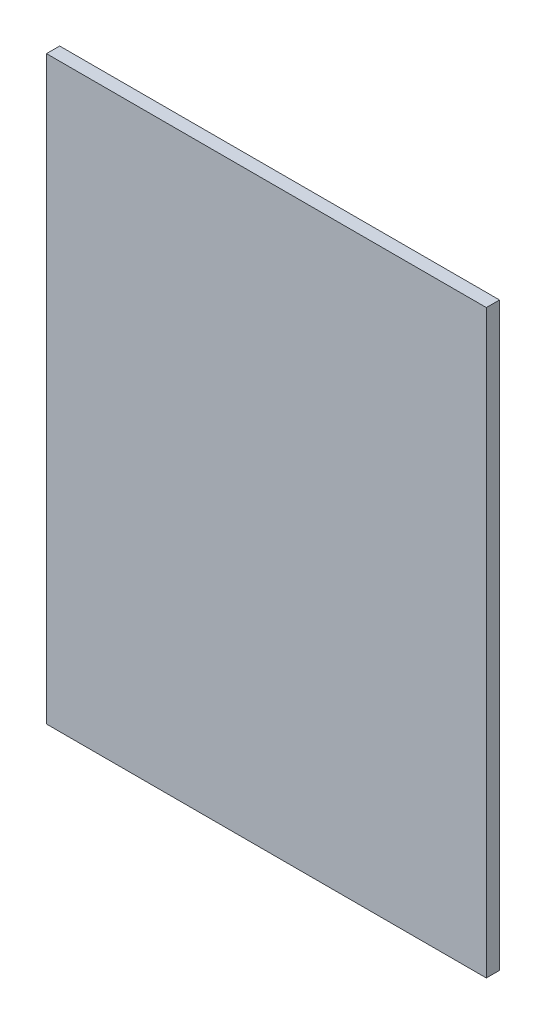
ISO-10303-21;
HEADER;
FILE_DESCRIPTION(('STEP AP214'),'2;1');
FILE_NAME('part.step','',(''),(''),'','','');
FILE_SCHEMA(('AUTOMOTIVE_DESIGN { 1 0 10303 214 1 1 1 1 }'));
ENDSEC;
DATA;
#1=APPLICATION_CONTEXT('core data for automotive mechanical design processes');
#2=APPLICATION_PROTOCOL_DEFINITION('international standard','automotive_design',2000,#1);
#3=PRODUCT_CONTEXT('',#1,'mechanical');
#4=PRODUCT('Part','Part','',(#3));
#5=PRODUCT_RELATED_PRODUCT_CATEGORY('part','',(#4));
#6=PRODUCT_DEFINITION_FORMATION('','',#4);
#7=PRODUCT_DEFINITION_CONTEXT('part definition',#1,'design');
#8=PRODUCT_DEFINITION('design','',#6,#7);
#9=PRODUCT_DEFINITION_SHAPE('','',#8);
#10=(LENGTH_UNIT() NAMED_UNIT(*) SI_UNIT(.MILLI.,.METRE.));
#11=(NAMED_UNIT(*) PLANE_ANGLE_UNIT() SI_UNIT($,.RADIAN.));
#12=(NAMED_UNIT(*) SI_UNIT($,.STERADIAN.) SOLID_ANGLE_UNIT());
#13=UNCERTAINTY_MEASURE_WITH_UNIT(LENGTH_MEASURE(1.E-05),#10,'distance_accuracy_value','');
#14=(GEOMETRIC_REPRESENTATION_CONTEXT(3) GLOBAL_UNCERTAINTY_ASSIGNED_CONTEXT((#13)) GLOBAL_UNIT_ASSIGNED_CONTEXT((#10,
#11,#12)) REPRESENTATION_CONTEXT('',''));
#15=CARTESIAN_POINT('',(0.,0.,0.));
#16=DIRECTION('',(0.,0.,1.));
#17=DIRECTION('',(1.,0.,0.));
#18=AXIS2_PLACEMENT_3D('',#15,#16,#17);
#19=CARTESIAN_POINT('',(0.,0.,18.));
#20=DIRECTION('',(1.,0.,0.));
#21=DIRECTION('',(0.,0.,-1.));
#22=AXIS2_PLACEMENT_3D('',#19,#20,#21);
#23=PLANE('',#22);
#24=DIRECTION('',(0.,-1.,0.));
#25=VECTOR('',#24,1.);
#26=CARTESIAN_POINT('',(0.,0.,0.));
#27=LINE('',#26,#25);
#28=CARTESIAN_POINT('',(0.,792.,0.));
#29=VERTEX_POINT('',#28);
#30=CARTESIAN_POINT('',(0.,0.,0.));
#31=VERTEX_POINT('',#30);
#32=EDGE_CURVE('E99',#29,#31,#27,.T.);
#33=ORIENTED_EDGE('',*,*,#32,.T.);
#34=DIRECTION('',(0.,0.,-1.));
#35=VECTOR('',#34,1.);
#36=CARTESIAN_POINT('',(0.,0.,18.));
#37=LINE('',#36,#35);
#38=CARTESIAN_POINT('',(0.,0.,18.));
#39=VERTEX_POINT('',#38);
#40=EDGE_CURVE('E11',#39,#31,#37,.T.);
#41=ORIENTED_EDGE('',*,*,#40,.F.);
#42=DIRECTION('',(0.,-1.,0.));
#43=VECTOR('',#42,1.);
#44=CARTESIAN_POINT('',(0.,0.,18.));
#45=LINE('',#44,#43);
#46=CARTESIAN_POINT('',(0.,792.,18.));
#47=VERTEX_POINT('',#46);
#48=EDGE_CURVE('E87',#47,#39,#45,.T.);
#49=ORIENTED_EDGE('',*,*,#48,.F.);
#50=DIRECTION('',(0.,0.,-1.));
#51=VECTOR('',#50,1.);
#52=CARTESIAN_POINT('',(0.,792.,18.));
#53=LINE('',#52,#51);
#54=EDGE_CURVE('E95',#47,#29,#53,.T.);
#55=ORIENTED_EDGE('',*,*,#54,.T.);
#56=EDGE_LOOP('',(#33,#41,#49,#55));
#57=FACE_BOUND('',#56,.T.);
#58=ADVANCED_FACE('F36',(#57),#23,.F.);
#59=CARTESIAN_POINT('',(0.,0.,18.));
#60=DIRECTION('',(0.,1.,0.));
#61=DIRECTION('',(0.,0.,1.));
#62=AXIS2_PLACEMENT_3D('',#59,#60,#61);
#63=PLANE('',#62);
#64=DIRECTION('',(1.,0.,0.));
#65=VECTOR('',#64,1.);
#66=CARTESIAN_POINT('',(0.,0.,0.));
#67=LINE('',#66,#65);
#68=CARTESIAN_POINT('',(600.,0.,0.));
#69=VERTEX_POINT('',#68);
#70=EDGE_CURVE('E91',#31,#69,#67,.T.);
#71=ORIENTED_EDGE('',*,*,#70,.T.);
#72=DIRECTION('',(0.,0.,-1.));
#73=VECTOR('',#72,1.);
#74=CARTESIAN_POINT('',(600.,0.,18.));
#75=LINE('',#74,#73);
#76=CARTESIAN_POINT('',(600.,0.,18.));
#77=VERTEX_POINT('',#76);
#78=EDGE_CURVE('E44',#77,#69,#75,.T.);
#79=ORIENTED_EDGE('',*,*,#78,.F.);
#80=DIRECTION('',(1.,0.,0.));
#81=VECTOR('',#80,1.);
#82=CARTESIAN_POINT('',(0.,0.,18.));
#83=LINE('',#82,#81);
#84=EDGE_CURVE('E82',#39,#77,#83,.T.);
#85=ORIENTED_EDGE('',*,*,#84,.F.);
#86=ORIENTED_EDGE('',*,*,#40,.T.);
#87=EDGE_LOOP('',(#71,#79,#85,#86));
#88=FACE_BOUND('',#87,.T.);
#89=ADVANCED_FACE('F90',(#88),#63,.F.);
#90=CARTESIAN_POINT('',(600.,0.,18.));
#91=DIRECTION('',(-1.,0.,0.));
#92=DIRECTION('',(0.,0.,1.));
#93=AXIS2_PLACEMENT_3D('',#90,#91,#92);
#94=PLANE('',#93);
#95=DIRECTION('',(0.,1.,0.));
#96=VECTOR('',#95,1.);
#97=CARTESIAN_POINT('',(600.,0.,0.));
#98=LINE('',#97,#96);
#99=CARTESIAN_POINT('',(600.,792.,0.));
#100=VERTEX_POINT('',#99);
#101=EDGE_CURVE('E69',#69,#100,#98,.T.);
#102=ORIENTED_EDGE('',*,*,#101,.T.);
#103=DIRECTION('',(0.,0.,-1.));
#104=VECTOR('',#103,1.);
#105=CARTESIAN_POINT('',(600.,792.,18.));
#106=LINE('',#105,#104);
#107=CARTESIAN_POINT('',(600.,792.,18.));
#108=VERTEX_POINT('',#107);
#109=EDGE_CURVE('E92',#108,#100,#106,.T.);
#110=ORIENTED_EDGE('',*,*,#109,.F.);
#111=DIRECTION('',(0.,1.,0.));
#112=VECTOR('',#111,1.);
#113=CARTESIAN_POINT('',(600.,0.,18.));
#114=LINE('',#113,#112);
#115=EDGE_CURVE('E85',#77,#108,#114,.T.);
#116=ORIENTED_EDGE('',*,*,#115,.F.);
#117=ORIENTED_EDGE('',*,*,#78,.T.);
#118=EDGE_LOOP('',(#102,#110,#116,#117));
#119=FACE_BOUND('',#118,.T.);
#120=ADVANCED_FACE('F93',(#119),#94,.F.);
#121=CARTESIAN_POINT('',(0.,792.,18.));
#122=DIRECTION('',(0.,-1.,0.));
#123=DIRECTION('',(0.,0.,-1.));
#124=AXIS2_PLACEMENT_3D('',#121,#122,#123);
#125=PLANE('',#124);
#126=DIRECTION('',(-1.,0.,0.));
#127=VECTOR('',#126,1.);
#128=CARTESIAN_POINT('',(0.,792.,0.));
#129=LINE('',#128,#127);
#130=EDGE_CURVE('E75',#100,#29,#129,.T.);
#131=ORIENTED_EDGE('',*,*,#130,.T.);
#132=ORIENTED_EDGE('',*,*,#54,.F.);
#133=DIRECTION('',(-1.,0.,0.));
#134=VECTOR('',#133,1.);
#135=CARTESIAN_POINT('',(0.,792.,18.));
#136=LINE('',#135,#134);
#137=EDGE_CURVE('E52',#108,#47,#136,.T.);
#138=ORIENTED_EDGE('',*,*,#137,.F.);
#139=ORIENTED_EDGE('',*,*,#109,.T.);
#140=EDGE_LOOP('',(#131,#132,#138,#139));
#141=FACE_BOUND('',#140,.T.);
#142=ADVANCED_FACE('F106',(#141),#125,.F.);
#143=CARTESIAN_POINT('',(0.,0.,18.));
#144=DIRECTION('',(0.,0.,-1.));
#145=DIRECTION('',(-1.,0.,0.));
#146=AXIS2_PLACEMENT_3D('',#143,#144,#145);
#147=PLANE('',#146);
#148=ORIENTED_EDGE('',*,*,#48,.T.);
#149=ORIENTED_EDGE('',*,*,#84,.T.);
#150=ORIENTED_EDGE('',*,*,#115,.T.);
#151=ORIENTED_EDGE('',*,*,#137,.T.);
#152=EDGE_LOOP('',(#148,#149,#150,#151));
#153=FACE_BOUND('',#152,.T.);
#154=ADVANCED_FACE('F83',(#153),#147,.F.);
#155=CARTESIAN_POINT('',(0.,0.,0.));
#156=DIRECTION('',(0.,0.,-1.));
#157=DIRECTION('',(-1.,0.,0.));
#158=AXIS2_PLACEMENT_3D('',#155,#156,#157);
#159=PLANE('',#158);
#160=ORIENTED_EDGE('',*,*,#32,.F.);
#161=ORIENTED_EDGE('',*,*,#130,.F.);
#162=ORIENTED_EDGE('',*,*,#101,.F.);
#163=ORIENTED_EDGE('',*,*,#70,.F.);
#164=EDGE_LOOP('',(#160,#161,#162,#163));
#165=FACE_BOUND('',#164,.T.);
#166=ADVANCED_FACE('F109',(#165),#159,.T.);
#167=CLOSED_SHELL('',(#58,#89,#120,#142,#154,#166));
#168=MANIFOLD_SOLID_BREP('B2',#167);
#169=ADVANCED_BREP_SHAPE_REPRESENTATION('',(#18,#168),#14);
#170=SHAPE_DEFINITION_REPRESENTATION(#9,#169);
ENDSEC;
END-ISO-10303-21;
